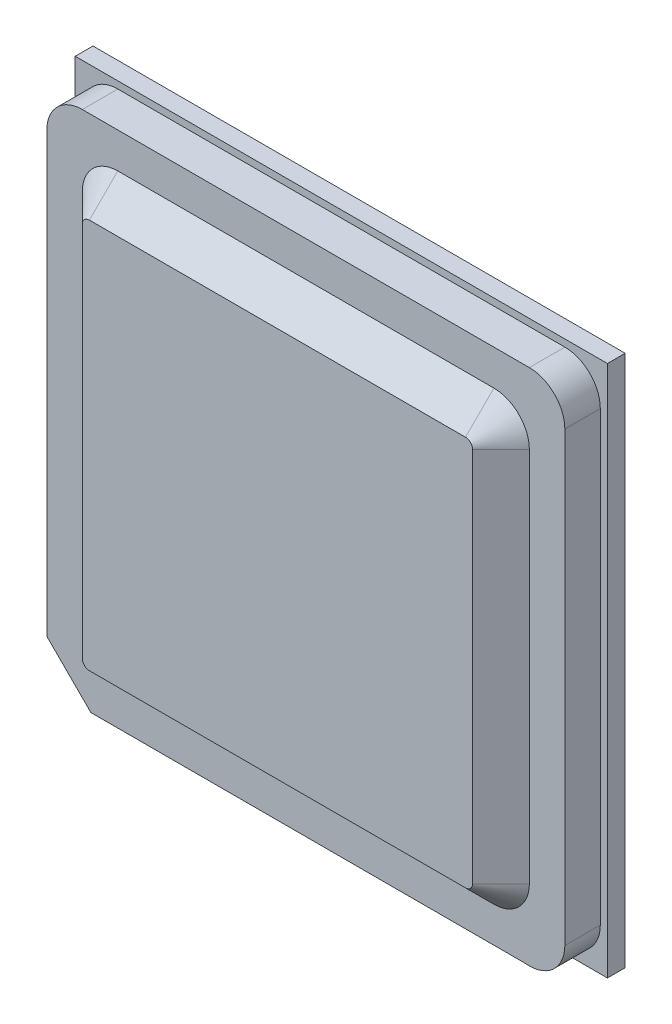
ISO-10303-21;
HEADER;
FILE_DESCRIPTION(('STEP AP214'),'2;1');
FILE_NAME('part.step','',(''),(''),'','','');
FILE_SCHEMA(('AUTOMOTIVE_DESIGN { 1 0 10303 214 1 1 1 1 }'));
ENDSEC;
DATA;
#1=APPLICATION_CONTEXT('core data for automotive mechanical design processes');
#2=APPLICATION_PROTOCOL_DEFINITION('international standard','automotive_design',2000,#1);
#3=PRODUCT_CONTEXT('',#1,'mechanical');
#4=PRODUCT('Part','Part','',(#3));
#5=PRODUCT_RELATED_PRODUCT_CATEGORY('part','',(#4));
#6=PRODUCT_DEFINITION_FORMATION('','',#4);
#7=PRODUCT_DEFINITION_CONTEXT('part definition',#1,'design');
#8=PRODUCT_DEFINITION('design','',#6,#7);
#9=PRODUCT_DEFINITION_SHAPE('','',#8);
#10=(LENGTH_UNIT() NAMED_UNIT(*) SI_UNIT(.MILLI.,.METRE.));
#11=(NAMED_UNIT(*) PLANE_ANGLE_UNIT() SI_UNIT($,.RADIAN.));
#12=(NAMED_UNIT(*) SI_UNIT($,.STERADIAN.) SOLID_ANGLE_UNIT());
#13=UNCERTAINTY_MEASURE_WITH_UNIT(LENGTH_MEASURE(1.E-05),#10,'distance_accuracy_value','');
#14=(GEOMETRIC_REPRESENTATION_CONTEXT(3) GLOBAL_UNCERTAINTY_ASSIGNED_CONTEXT((#13)) GLOBAL_UNIT_ASSIGNED_CONTEXT((#10,
#11,#12)) REPRESENTATION_CONTEXT('',''));
#15=CARTESIAN_POINT('',(0.,0.,0.));
#16=DIRECTION('',(0.,0.,1.));
#17=DIRECTION('',(1.,0.,0.));
#18=AXIS2_PLACEMENT_3D('',#15,#16,#17);
#19=CARTESIAN_POINT('',(-5.3,-5.3,2.3));
#20=DIRECTION('',(0.,0.,1.));
#21=DIRECTION('',(1.,0.,0.));
#22=AXIS2_PLACEMENT_3D('',#19,#20,#21);
#23=PLANE('',#22);
#24=CARTESIAN_POINT('',(-5.3,5.3,2.30000000004793));
#25=DIRECTION('',(0.,0.,-1.));
#26=DIRECTION('',(-1.,0.,0.));
#27=AXIS2_PLACEMENT_3D('',#24,#25,#26);
#28=CIRCLE('',#27,0.199999999983628);
#29=CARTESIAN_POINT('',(-5.49999999997603,5.3,2.30000000002397));
#30=VERTEX_POINT('',#29);
#31=CARTESIAN_POINT('',(-5.3,5.49999999998501,2.30000000005016));
#32=VERTEX_POINT('',#31);
#33=EDGE_CURVE('E182',#30,#32,#28,.T.);
#34=ORIENTED_EDGE('',*,*,#33,.F.);
#35=DIRECTION('',(0.,1.,0.));
#36=VECTOR('',#35,1.);
#37=CARTESIAN_POINT('',(-5.5,-5.3,2.3));
#38=LINE('',#37,#36);
#39=CARTESIAN_POINT('',(-5.49999999999923,-5.3,2.29999999995068));
#40=VERTEX_POINT('',#39);
#41=EDGE_CURVE('E159',#40,#30,#38,.T.);
#42=ORIENTED_EDGE('',*,*,#41,.F.);
#43=CARTESIAN_POINT('',(-5.3,-5.3,2.29999999993424));
#44=DIRECTION('',(0.,0.,-1.));
#45=DIRECTION('',(-1.,0.,0.));
#46=AXIS2_PLACEMENT_3D('',#43,#44,#45);
#47=CIRCLE('',#46,0.199999999972807);
#48=CARTESIAN_POINT('',(-5.3,-5.49999999999923,2.29999999995068));
#49=VERTEX_POINT('',#48);
#50=EDGE_CURVE('E20',#40,#49,#47,.F.);
#51=ORIENTED_EDGE('',*,*,#50,.T.);
#52=DIRECTION('',(1.,0.,0.));
#53=VECTOR('',#52,1.);
#54=CARTESIAN_POINT('',(-5.3,-5.5,2.3));
#55=LINE('',#54,#53);
#56=CARTESIAN_POINT('',(5.3,-5.49999999999923,2.29999999995068));
#57=VERTEX_POINT('',#56);
#58=EDGE_CURVE('E157',#57,#49,#55,.F.);
#59=ORIENTED_EDGE('',*,*,#58,.F.);
#60=CARTESIAN_POINT('',(5.3,-5.3,2.29999999993424));
#61=DIRECTION('',(0.,0.,-1.));
#62=DIRECTION('',(-1.,0.,0.));
#63=AXIS2_PLACEMENT_3D('',#60,#61,#62);
#64=CIRCLE('',#63,0.199999999972805);
#65=CARTESIAN_POINT('',(5.50000000003288,-5.3,2.29999999996712));
#66=VERTEX_POINT('',#65);
#67=EDGE_CURVE('E168',#66,#57,#64,.T.);
#68=ORIENTED_EDGE('',*,*,#67,.F.);
#69=DIRECTION('',(0.,1.,0.));
#70=VECTOR('',#69,1.);
#71=CARTESIAN_POINT('',(5.5,-5.3,2.3));
#72=LINE('',#71,#70);
#73=CARTESIAN_POINT('',(5.49999999999923,5.3,2.29999999999332));
#74=VERTEX_POINT('',#73);
#75=EDGE_CURVE('E191',#74,#66,#72,.F.);
#76=ORIENTED_EDGE('',*,*,#75,.F.);
#77=CARTESIAN_POINT('',(5.3,5.3,2.29999999999109));
#78=DIRECTION('',(0.,0.,-1.));
#79=DIRECTION('',(0.,1.,0.));
#80=AXIS2_PLACEMENT_3D('',#77,#78,#79);
#81=CIRCLE('',#80,0.199999999983629);
#82=CARTESIAN_POINT('',(5.3,5.50000000000445,2.29999999999554));
#83=VERTEX_POINT('',#82);
#84=EDGE_CURVE('E188',#83,#74,#81,.T.);
#85=ORIENTED_EDGE('',*,*,#84,.F.);
#86=DIRECTION('',(1.,0.,0.));
#87=VECTOR('',#86,1.);
#88=CARTESIAN_POINT('',(-5.3,5.5,2.3));
#89=LINE('',#88,#87);
#90=EDGE_CURVE('E185',#32,#83,#89,.T.);
#91=ORIENTED_EDGE('',*,*,#90,.F.);
#92=EDGE_LOOP('',(#34,#42,#51,#59,#68,#76,#85,#91));
#93=FACE_BOUND('',#92,.T.);
#94=ADVANCED_FACE('F17',(#93),#23,.T.);
#95=CARTESIAN_POINT('',(-5.3,-6.3,1.5));
#96=DIRECTION('',(0.,-0.707106781186547,0.707106781186548));
#97=DIRECTION('',(0.,-0.707106781186548,-0.707106781186547));
#98=AXIS2_PLACEMENT_3D('',#95,#96,#97);
#99=PLANE('',#98);
#100=ORIENTED_EDGE('',*,*,#58,.T.);
#101=DIRECTION('',(0.,0.707106781186548,0.707106781186547));
#102=VECTOR('',#101,1.);
#103=CARTESIAN_POINT('',(-5.29999999996945,-499007.800000001,-499000.));
#104=LINE('',#103,#102);
#105=CARTESIAN_POINT('',(-5.3,-6.29999999998834,1.4999999999734));
#106=VERTEX_POINT('',#105);
#107=EDGE_CURVE('E165',#106,#49,#104,.T.);
#108=ORIENTED_EDGE('',*,*,#107,.F.);
#109=DIRECTION('',(-1.,0.,0.));
#110=VECTOR('',#109,1.);
#111=CARTESIAN_POINT('',(6.3,-6.3,1.5));
#112=LINE('',#111,#110);
#113=CARTESIAN_POINT('',(5.3,-6.29999999998834,1.4999999999734));
#114=VERTEX_POINT('',#113);
#115=EDGE_CURVE('E175',#106,#114,#112,.F.);
#116=ORIENTED_EDGE('',*,*,#115,.T.);
#117=DIRECTION('',(0.,0.707106781186548,0.707106781186547));
#118=VECTOR('',#117,1.);
#119=CARTESIAN_POINT('',(5.30000000009166,-499007.800000001,-499000.));
#120=LINE('',#119,#118);
#121=EDGE_CURVE('E167',#57,#114,#120,.F.);
#122=ORIENTED_EDGE('',*,*,#121,.F.);
#123=EDGE_LOOP('',(#100,#108,#116,#122));
#124=FACE_BOUND('',#123,.T.);
#125=ADVANCED_FACE('F163',(#124),#99,.T.);
#126=CARTESIAN_POINT('',(5.3,-5.3,1.49999999996453));
#127=DIRECTION('',(0.,0.,-1.));
#128=DIRECTION('',(-1.,0.,0.));
#129=AXIS2_PLACEMENT_3D('',#126,#127,#128);
#130=CONICAL_SURFACE('',#129,0.999999999942519,0.785398163397448);
#131=ORIENTED_EDGE('',*,*,#67,.T.);
#132=ORIENTED_EDGE('',*,*,#121,.T.);
#133=CARTESIAN_POINT('',(5.3,-5.3,1.49999999996453));
#134=DIRECTION('',(0.,0.,-1.));
#135=DIRECTION('',(-1.,0.,0.));
#136=AXIS2_PLACEMENT_3D('',#133,#134,#135);
#137=CIRCLE('',#136,0.999999999942519);
#138=CARTESIAN_POINT('',(6.30000000001773,-5.3,1.49999999998226));
#139=VERTEX_POINT('',#138);
#140=EDGE_CURVE('E231',#114,#139,#137,.F.);
#141=ORIENTED_EDGE('',*,*,#140,.T.);
#142=DIRECTION('',(0.707106781186548,0.,-0.707106781186547));
#143=VECTOR('',#142,1.);
#144=CARTESIAN_POINT('',(6.3,-5.3,1.5));
#145=LINE('',#144,#143);
#146=EDGE_CURVE('E189',#66,#139,#145,.T.);
#147=ORIENTED_EDGE('',*,*,#146,.F.);
#148=EDGE_LOOP('',(#131,#132,#141,#147));
#149=FACE_BOUND('',#148,.T.);
#150=ADVANCED_FACE('F241',(#149),#130,.T.);
#151=CARTESIAN_POINT('',(6.3,-5.3,1.5));
#152=DIRECTION('',(0.707106781186547,0.,0.707106781186548));
#153=DIRECTION('',(0.707106781186548,0.,-0.707106781186547));
#154=AXIS2_PLACEMENT_3D('',#151,#152,#153);
#155=PLANE('',#154);
#156=ORIENTED_EDGE('',*,*,#75,.T.);
#157=ORIENTED_EDGE('',*,*,#146,.T.);
#158=DIRECTION('',(0.,1.,0.));
#159=VECTOR('',#158,1.);
#160=CARTESIAN_POINT('',(6.3,-6.30624362077431,1.5));
#161=LINE('',#160,#159);
#162=CARTESIAN_POINT('',(6.29999999998834,5.3,1.50000000001603));
#163=VERTEX_POINT('',#162);
#164=EDGE_CURVE('E230',#139,#163,#161,.T.);
#165=ORIENTED_EDGE('',*,*,#164,.T.);
#166=DIRECTION('',(-0.707106781186548,0.,0.707106781186547));
#167=VECTOR('',#166,1.);
#168=CARTESIAN_POINT('',(499000.,5.3,-498992.199999999));
#169=LINE('',#168,#167);
#170=EDGE_CURVE('E186',#74,#163,#169,.F.);
#171=ORIENTED_EDGE('',*,*,#170,.F.);
#172=EDGE_LOOP('',(#156,#157,#165,#171));
#173=FACE_BOUND('',#172,.T.);
#174=ADVANCED_FACE('F250',(#173),#155,.T.);
#175=CARTESIAN_POINT('',(5.3,5.3,1.50000000002137));
#176=DIRECTION('',(0.,0.,-1.));
#177=DIRECTION('',(0.,1.,0.));
#178=AXIS2_PLACEMENT_3D('',#175,#176,#177);
#179=CONICAL_SURFACE('',#178,0.999999999953343,0.785398163397448);
#180=ORIENTED_EDGE('',*,*,#84,.T.);
#181=ORIENTED_EDGE('',*,*,#170,.T.);
#182=CARTESIAN_POINT('',(5.3,5.3,1.50000000002137));
#183=DIRECTION('',(0.,0.,-1.));
#184=DIRECTION('',(0.,1.,0.));
#185=AXIS2_PLACEMENT_3D('',#182,#183,#184);
#186=CIRCLE('',#185,0.999999999953343);
#187=CARTESIAN_POINT('',(5.3,6.29999999998931,1.50000000001069));
#188=VERTEX_POINT('',#187);
#189=EDGE_CURVE('E227',#163,#188,#186,.F.);
#190=ORIENTED_EDGE('',*,*,#189,.T.);
#191=DIRECTION('',(0.,-0.707106781186548,0.707106781186547));
#192=VECTOR('',#191,1.);
#193=CARTESIAN_POINT('',(5.3,6.3,1.5));
#194=LINE('',#193,#192);
#195=EDGE_CURVE('E183',#83,#188,#194,.F.);
#196=ORIENTED_EDGE('',*,*,#195,.F.);
#197=EDGE_LOOP('',(#180,#181,#190,#196));
#198=FACE_BOUND('',#197,.T.);
#199=ADVANCED_FACE('F254',(#198),#179,.T.);
#200=CARTESIAN_POINT('',(-5.3,6.3,1.5));
#201=DIRECTION('',(0.,0.707106781186547,0.707106781186548));
#202=DIRECTION('',(0.,-0.707106781186548,0.707106781186547));
#203=AXIS2_PLACEMENT_3D('',#200,#201,#202);
#204=PLANE('',#203);
#205=ORIENTED_EDGE('',*,*,#90,.T.);
#206=ORIENTED_EDGE('',*,*,#195,.T.);
#207=DIRECTION('',(-1.,0.,0.));
#208=VECTOR('',#207,1.);
#209=CARTESIAN_POINT('',(6.3,6.3,1.5));
#210=LINE('',#209,#208);
#211=CARTESIAN_POINT('',(-5.3,6.29999999998834,1.50000000001603));
#212=VERTEX_POINT('',#211);
#213=EDGE_CURVE('E226',#188,#212,#210,.T.);
#214=ORIENTED_EDGE('',*,*,#213,.T.);
#215=DIRECTION('',(0.,-0.707106781186548,0.707106781186547));
#216=VECTOR('',#215,1.);
#217=CARTESIAN_POINT('',(-5.30000000003056,499000.,-498992.199999999));
#218=LINE('',#217,#216);
#219=EDGE_CURVE('E180',#32,#212,#218,.F.);
#220=ORIENTED_EDGE('',*,*,#219,.F.);
#221=EDGE_LOOP('',(#205,#206,#214,#220));
#222=FACE_BOUND('',#221,.T.);
#223=ADVANCED_FACE('F445',(#222),#204,.T.);
#224=CARTESIAN_POINT('',(-5.3,5.3,1.50000000013506));
#225=DIRECTION('',(0.,0.,-1.));
#226=DIRECTION('',(-1.,0.,0.));
#227=AXIS2_PLACEMENT_3D('',#224,#225,#226);
#228=CONICAL_SURFACE('',#227,0.999999999896499,0.785398163397448);
#229=ORIENTED_EDGE('',*,*,#33,.T.);
#230=ORIENTED_EDGE('',*,*,#219,.T.);
#231=CARTESIAN_POINT('',(-5.3,5.3,1.50000000002137));
#232=DIRECTION('',(0.,0.,-1.));
#233=DIRECTION('',(-1.,0.,0.));
#234=AXIS2_PLACEMENT_3D('',#231,#232,#233);
#235=CIRCLE('',#234,1.00000000001019);
#236=CARTESIAN_POINT('',(-6.29999999998931,5.3,1.50000000001069));
#237=VERTEX_POINT('',#236);
#238=EDGE_CURVE('E223',#212,#237,#235,.F.);
#239=ORIENTED_EDGE('',*,*,#238,.T.);
#240=DIRECTION('',(0.707106781186548,0.,0.707106781186547));
#241=VECTOR('',#240,1.);
#242=CARTESIAN_POINT('',(-6.3,5.3,1.5));
#243=LINE('',#242,#241);
#244=EDGE_CURVE('E173',#30,#237,#243,.F.);
#245=ORIENTED_EDGE('',*,*,#244,.F.);
#246=EDGE_LOOP('',(#229,#230,#239,#245));
#247=FACE_BOUND('',#246,.T.);
#248=ADVANCED_FACE('F441',(#247),#228,.T.);
#249=CARTESIAN_POINT('',(-6.3,-5.3,1.5));
#250=DIRECTION('',(-0.707106781186547,0.,0.707106781186548));
#251=DIRECTION('',(0.707106781186548,0.,0.707106781186547));
#252=AXIS2_PLACEMENT_3D('',#249,#250,#251);
#253=PLANE('',#252);
#254=ORIENTED_EDGE('',*,*,#41,.T.);
#255=ORIENTED_EDGE('',*,*,#244,.T.);
#256=DIRECTION('',(0.,1.,0.));
#257=VECTOR('',#256,1.);
#258=CARTESIAN_POINT('',(-6.3,-6.30624362077431,1.5));
#259=LINE('',#258,#257);
#260=CARTESIAN_POINT('',(-6.29999999998834,-5.3,1.4999999999734));
#261=VERTEX_POINT('',#260);
#262=EDGE_CURVE('E222',#237,#261,#259,.F.);
#263=ORIENTED_EDGE('',*,*,#262,.T.);
#264=DIRECTION('',(0.707106781186548,0.,0.707106781186547));
#265=VECTOR('',#264,1.);
#266=CARTESIAN_POINT('',(-499007.800000001,-5.30000000006111,-499000.));
#267=LINE('',#266,#265);
#268=EDGE_CURVE('E172',#40,#261,#267,.F.);
#269=ORIENTED_EDGE('',*,*,#268,.F.);
#270=EDGE_LOOP('',(#254,#255,#263,#269));
#271=FACE_BOUND('',#270,.T.);
#272=ADVANCED_FACE('F438',(#271),#253,.T.);
#273=CARTESIAN_POINT('',(-5.3,-5.3,1.49999999996453));
#274=DIRECTION('',(0.,0.,-1.));
#275=DIRECTION('',(-1.,0.,0.));
#276=AXIS2_PLACEMENT_3D('',#273,#274,#275);
#277=CONICAL_SURFACE('',#276,0.999999999942521,0.785398163397448);
#278=ORIENTED_EDGE('',*,*,#50,.F.);
#279=ORIENTED_EDGE('',*,*,#268,.T.);
#280=CARTESIAN_POINT('',(-5.3,-5.3,1.49999999996453));
#281=DIRECTION('',(0.,0.,-1.));
#282=DIRECTION('',(-1.,0.,0.));
#283=AXIS2_PLACEMENT_3D('',#280,#281,#282);
#284=CIRCLE('',#283,0.999999999942521);
#285=EDGE_CURVE('E171',#261,#106,#284,.F.);
#286=ORIENTED_EDGE('',*,*,#285,.T.);
#287=ORIENTED_EDGE('',*,*,#107,.T.);
#288=EDGE_LOOP('',(#278,#279,#286,#287));
#289=FACE_BOUND('',#288,.T.);
#290=ADVANCED_FACE('F169',(#289),#277,.T.);
#291=CARTESIAN_POINT('',(-7.01350631817886,-7.01350631817886,0.4));
#292=DIRECTION('',(0.,0.,1.));
#293=DIRECTION('',(1.,0.,0.));
#294=AXIS2_PLACEMENT_3D('',#291,#292,#293);
#295=PLANE('',#294);
#296=CARTESIAN_POINT('',(-7.01350631817886,-7.01350631817886,0.4));
#297=DIRECTION('',(0.,0.,1.));
#298=DIRECTION('',(1.,0.,0.));
#299=AXIS2_PLACEMENT_3D('',#296,#297,#298);
#300=CIRCLE('',#299,0.2);
#301=CARTESIAN_POINT('',(-6.81350631817886,-7.01350631817886,0.4));
#302=VERTEX_POINT('',#301);
#303=EDGE_CURVE('E218',#302,#302,#300,.T.);
#304=ORIENTED_EDGE('',*,*,#303,.T.);
#305=EDGE_LOOP('',(#304));
#306=FACE_BOUND('',#305,.T.);
#307=ADVANCED_FACE('F432',(#306),#295,.T.);
#308=CARTESIAN_POINT('',(6.3,-6.30624362077431,1.5));
#309=DIRECTION('',(0.,0.,-1.));
#310=DIRECTION('',(-1.,0.,0.));
#311=AXIS2_PLACEMENT_3D('',#308,#309,#310);
#312=PLANE('',#311);
#313=ORIENTED_EDGE('',*,*,#262,.F.);
#314=ORIENTED_EDGE('',*,*,#238,.F.);
#315=ORIENTED_EDGE('',*,*,#213,.F.);
#316=ORIENTED_EDGE('',*,*,#189,.F.);
#317=ORIENTED_EDGE('',*,*,#164,.F.);
#318=ORIENTED_EDGE('',*,*,#140,.F.);
#319=ORIENTED_EDGE('',*,*,#115,.F.);
#320=ORIENTED_EDGE('',*,*,#285,.F.);
#321=EDGE_LOOP('',(#313,#314,#315,#316,#317,#318,#319,#320));
#322=FACE_BOUND('',#321,.T.);
#323=DIRECTION('',(0.,1.,0.));
#324=VECTOR('',#323,1.);
#325=CARTESIAN_POINT('',(7.3,-6.30624362077431,1.5));
#326=LINE('',#325,#324);
#327=CARTESIAN_POINT('',(7.3,-6.30624362077431,1.5));
#328=VERTEX_POINT('',#327);
#329=CARTESIAN_POINT('',(7.3,6.3,1.5));
#330=VERTEX_POINT('',#329);
#331=EDGE_CURVE('E297',#328,#330,#326,.T.);
#332=ORIENTED_EDGE('',*,*,#331,.T.);
#333=CARTESIAN_POINT('',(6.3,6.3,1.5));
#334=DIRECTION('',(0.,0.,-1.));
#335=DIRECTION('',(-1.,0.,0.));
#336=AXIS2_PLACEMENT_3D('',#333,#334,#335);
#337=CIRCLE('',#336,1.);
#338=CARTESIAN_POINT('',(6.3,7.3,1.5));
#339=VERTEX_POINT('',#338);
#340=EDGE_CURVE('E207',#339,#330,#337,.T.);
#341=ORIENTED_EDGE('',*,*,#340,.F.);
#342=DIRECTION('',(1.,0.,0.));
#343=VECTOR('',#342,1.);
#344=CARTESIAN_POINT('',(6.3,7.3,1.5));
#345=LINE('',#344,#343);
#346=CARTESIAN_POINT('',(-6.3,7.3,1.5));
#347=VERTEX_POINT('',#346);
#348=EDGE_CURVE('E213',#339,#347,#345,.F.);
#349=ORIENTED_EDGE('',*,*,#348,.T.);
#350=CARTESIAN_POINT('',(-6.3,6.3,1.5));
#351=DIRECTION('',(0.,0.,-1.));
#352=DIRECTION('',(-1.,0.,0.));
#353=AXIS2_PLACEMENT_3D('',#350,#351,#352);
#354=CIRCLE('',#353,1.);
#355=CARTESIAN_POINT('',(-7.3,6.3,1.5));
#356=VERTEX_POINT('',#355);
#357=EDGE_CURVE('E211',#356,#347,#354,.T.);
#358=ORIENTED_EDGE('',*,*,#357,.F.);
#359=DIRECTION('',(0.,1.,0.));
#360=VECTOR('',#359,1.);
#361=CARTESIAN_POINT('',(-7.3,-6.06,1.5));
#362=LINE('',#361,#360);
#363=CARTESIAN_POINT('',(-7.3,-6.06,1.5));
#364=VERTEX_POINT('',#363);
#365=EDGE_CURVE('E273',#356,#364,#362,.F.);
#366=ORIENTED_EDGE('',*,*,#365,.T.);
#367=DIRECTION('',(-0.707106781186547,0.707106781186548,0.));
#368=VECTOR('',#367,1.);
#369=CARTESIAN_POINT('',(-7.3,-6.06,1.5));
#370=LINE('',#369,#368);
#371=CARTESIAN_POINT('',(-6.06,-7.3,1.5));
#372=VERTEX_POINT('',#371);
#373=EDGE_CURVE('E280',#364,#372,#370,.F.);
#374=ORIENTED_EDGE('',*,*,#373,.T.);
#375=DIRECTION('',(-1.,0.,0.));
#376=VECTOR('',#375,1.);
#377=CARTESIAN_POINT('',(-6.06,-7.3,1.5));
#378=LINE('',#377,#376);
#379=CARTESIAN_POINT('',(6.18842823498641,-7.3,1.5));
#380=VERTEX_POINT('',#379);
#381=EDGE_CURVE('E217',#372,#380,#378,.F.);
#382=ORIENTED_EDGE('',*,*,#381,.T.);
#383=CARTESIAN_POINT('',(6.3,-6.30624362077431,1.5));
#384=DIRECTION('',(0.,0.,-1.));
#385=DIRECTION('',(-1.,0.,0.));
#386=AXIS2_PLACEMENT_3D('',#383,#384,#385);
#387=CIRCLE('',#386,1.);
#388=EDGE_CURVE('E215',#328,#380,#387,.T.);
#389=ORIENTED_EDGE('',*,*,#388,.F.);
#390=EDGE_LOOP('',(#332,#341,#349,#358,#366,#374,#382,#389));
#391=FACE_BOUND('',#390,.T.);
#392=ADVANCED_FACE('F258',(#322,#391),#312,.F.);
#393=CARTESIAN_POINT('',(-7.01350631817886,-7.01350631817886,0.4));
#394=DIRECTION('',(0.,0.,1.));
#395=DIRECTION('',(1.,0.,0.));
#396=AXIS2_PLACEMENT_3D('',#393,#394,#395);
#397=CYLINDRICAL_SURFACE('',#396,0.2);
#398=CARTESIAN_POINT('',(-7.01350631817886,-7.01350631817886,0.5));
#399=DIRECTION('',(0.,0.,1.));
#400=DIRECTION('',(1.,0.,0.));
#401=AXIS2_PLACEMENT_3D('',#398,#399,#400);
#402=CIRCLE('',#401,0.2);
#403=CARTESIAN_POINT('',(-6.81350631817886,-7.01350631817886,0.5));
#404=VERTEX_POINT('',#403);
#405=EDGE_CURVE('E203',#404,#404,#402,.F.);
#406=ORIENTED_EDGE('',*,*,#405,.F.);
#407=EDGE_LOOP('',(#406));
#408=FACE_BOUND('',#407,.T.);
#409=ORIENTED_EDGE('',*,*,#303,.F.);
#410=EDGE_LOOP('',(#409));
#411=FACE_BOUND('',#410,.T.);
#412=ADVANCED_FACE('F426',(#408,#411),#397,.F.);
#413=CARTESIAN_POINT('',(6.3,-6.30624362077431,1.5));
#414=DIRECTION('',(0.,0.,-1.));
#415=DIRECTION('',(-1.,0.,0.));
#416=AXIS2_PLACEMENT_3D('',#413,#414,#415);
#417=CYLINDRICAL_SURFACE('',#416,1.);
#418=ORIENTED_EDGE('',*,*,#388,.T.);
#419=DIRECTION('',(0.,0.,1.));
#420=VECTOR('',#419,1.);
#421=CARTESIAN_POINT('',(6.18842823498642,-7.3,1.5));
#422=LINE('',#421,#420);
#423=CARTESIAN_POINT('',(6.18842823498641,-7.3,0.5));
#424=VERTEX_POINT('',#423);
#425=EDGE_CURVE('E283',#380,#424,#422,.F.);
#426=ORIENTED_EDGE('',*,*,#425,.T.);
#427=CARTESIAN_POINT('',(6.3,-6.30624362077431,0.5));
#428=DIRECTION('',(0.,0.,-1.));
#429=DIRECTION('',(-1.,0.,0.));
#430=AXIS2_PLACEMENT_3D('',#427,#428,#429);
#431=CIRCLE('',#430,1.);
#432=CARTESIAN_POINT('',(7.3,-6.30624362077431,0.5));
#433=VERTEX_POINT('',#432);
#434=EDGE_CURVE('E200',#433,#424,#431,.T.);
#435=ORIENTED_EDGE('',*,*,#434,.F.);
#436=DIRECTION('',(0.,0.,1.));
#437=VECTOR('',#436,1.);
#438=CARTESIAN_POINT('',(7.3,-6.30624362077431,1.5));
#439=LINE('',#438,#437);
#440=EDGE_CURVE('E209',#433,#328,#439,.T.);
#441=ORIENTED_EDGE('',*,*,#440,.T.);
#442=EDGE_LOOP('',(#418,#426,#435,#441));
#443=FACE_BOUND('',#442,.T.);
#444=ADVANCED_FACE('F423',(#443),#417,.T.);
#445=CARTESIAN_POINT('',(-6.06,-7.3,1.5));
#446=DIRECTION('',(0.,1.,0.));
#447=DIRECTION('',(-1.,0.,0.));
#448=AXIS2_PLACEMENT_3D('',#445,#446,#447);
#449=PLANE('',#448);
#450=ORIENTED_EDGE('',*,*,#425,.F.);
#451=ORIENTED_EDGE('',*,*,#381,.F.);
#452=DIRECTION('',(0.,0.,1.));
#453=VECTOR('',#452,1.);
#454=CARTESIAN_POINT('',(-6.06,-7.3,1.5));
#455=LINE('',#454,#453);
#456=CARTESIAN_POINT('',(-6.06,-7.3,0.5));
#457=VERTEX_POINT('',#456);
#458=EDGE_CURVE('E277',#372,#457,#455,.F.);
#459=ORIENTED_EDGE('',*,*,#458,.T.);
#460=DIRECTION('',(1.,0.,0.));
#461=VECTOR('',#460,1.);
#462=CARTESIAN_POINT('',(0.,-7.3,0.5));
#463=LINE('',#462,#461);
#464=EDGE_CURVE('E202',#424,#457,#463,.F.);
#465=ORIENTED_EDGE('',*,*,#464,.F.);
#466=EDGE_LOOP('',(#450,#451,#459,#465));
#467=FACE_BOUND('',#466,.T.);
#468=ADVANCED_FACE('F324',(#467),#449,.F.);
#469=CARTESIAN_POINT('',(-7.3,-6.06,1.5));
#470=DIRECTION('',(0.707106781186548,0.707106781186547,0.));
#471=DIRECTION('',(-0.707106781186547,0.707106781186548,0.));
#472=AXIS2_PLACEMENT_3D('',#469,#470,#471);
#473=PLANE('',#472);
#474=ORIENTED_EDGE('',*,*,#458,.F.);
#475=ORIENTED_EDGE('',*,*,#373,.F.);
#476=DIRECTION('',(0.,0.,1.));
#477=VECTOR('',#476,1.);
#478=CARTESIAN_POINT('',(-7.3,-6.06,1.5));
#479=LINE('',#478,#477);
#480=CARTESIAN_POINT('',(-7.3,-6.06,0.5));
#481=VERTEX_POINT('',#480);
#482=EDGE_CURVE('E276',#364,#481,#479,.F.);
#483=ORIENTED_EDGE('',*,*,#482,.T.);
#484=DIRECTION('',(-0.707106781186547,0.707106781186548,0.));
#485=VECTOR('',#484,1.);
#486=CARTESIAN_POINT('',(-6.06,-7.3,0.5));
#487=LINE('',#486,#485);
#488=EDGE_CURVE('E317',#457,#481,#487,.T.);
#489=ORIENTED_EDGE('',*,*,#488,.F.);
#490=EDGE_LOOP('',(#474,#475,#483,#489));
#491=FACE_BOUND('',#490,.T.);
#492=ADVANCED_FACE('F326',(#491),#473,.F.);
#493=CARTESIAN_POINT('',(-7.3,-6.06,1.5));
#494=DIRECTION('',(1.,0.,0.));
#495=DIRECTION('',(0.,1.,0.));
#496=AXIS2_PLACEMENT_3D('',#493,#494,#495);
#497=PLANE('',#496);
#498=ORIENTED_EDGE('',*,*,#482,.F.);
#499=ORIENTED_EDGE('',*,*,#365,.F.);
#500=DIRECTION('',(0.,0.,-1.));
#501=VECTOR('',#500,1.);
#502=CARTESIAN_POINT('',(-7.3,6.3,1.5));
#503=LINE('',#502,#501);
#504=CARTESIAN_POINT('',(-7.3,6.3,0.5));
#505=VERTEX_POINT('',#504);
#506=EDGE_CURVE('E214',#505,#356,#503,.F.);
#507=ORIENTED_EDGE('',*,*,#506,.F.);
#508=DIRECTION('',(0.,1.,0.));
#509=VECTOR('',#508,1.);
#510=CARTESIAN_POINT('',(-7.3,0.,0.5));
#511=LINE('',#510,#509);
#512=EDGE_CURVE('E199',#481,#505,#511,.T.);
#513=ORIENTED_EDGE('',*,*,#512,.F.);
#514=EDGE_LOOP('',(#498,#499,#507,#513));
#515=FACE_BOUND('',#514,.T.);
#516=ADVANCED_FACE('F414',(#515),#497,.F.);
#517=CARTESIAN_POINT('',(-6.3,6.3,1.5));
#518=DIRECTION('',(0.,0.,-1.));
#519=DIRECTION('',(-1.,0.,0.));
#520=AXIS2_PLACEMENT_3D('',#517,#518,#519);
#521=CYLINDRICAL_SURFACE('',#520,1.);
#522=ORIENTED_EDGE('',*,*,#357,.T.);
#523=DIRECTION('',(0.,0.,-1.));
#524=VECTOR('',#523,1.);
#525=CARTESIAN_POINT('',(-6.3,7.3,1.5));
#526=LINE('',#525,#524);
#527=CARTESIAN_POINT('',(-6.3,7.3,0.5));
#528=VERTEX_POINT('',#527);
#529=EDGE_CURVE('E272',#347,#528,#526,.T.);
#530=ORIENTED_EDGE('',*,*,#529,.T.);
#531=CARTESIAN_POINT('',(-6.3,6.3,0.5));
#532=DIRECTION('',(0.,0.,-1.));
#533=DIRECTION('',(-1.,0.,0.));
#534=AXIS2_PLACEMENT_3D('',#531,#532,#533);
#535=CIRCLE('',#534,1.);
#536=EDGE_CURVE('E197',#505,#528,#535,.T.);
#537=ORIENTED_EDGE('',*,*,#536,.F.);
#538=ORIENTED_EDGE('',*,*,#506,.T.);
#539=EDGE_LOOP('',(#522,#530,#537,#538));
#540=FACE_BOUND('',#539,.T.);
#541=ADVANCED_FACE('F410',(#540),#521,.T.);
#542=CARTESIAN_POINT('',(6.3,7.3,1.5));
#543=DIRECTION('',(0.,-1.,0.));
#544=DIRECTION('',(0.,0.,-1.));
#545=AXIS2_PLACEMENT_3D('',#542,#543,#544);
#546=PLANE('',#545);
#547=ORIENTED_EDGE('',*,*,#529,.F.);
#548=ORIENTED_EDGE('',*,*,#348,.F.);
#549=DIRECTION('',(0.,0.,-1.));
#550=VECTOR('',#549,1.);
#551=CARTESIAN_POINT('',(6.3,7.3,1.5));
#552=LINE('',#551,#550);
#553=CARTESIAN_POINT('',(6.3,7.3,0.5));
#554=VERTEX_POINT('',#553);
#555=EDGE_CURVE('E210',#554,#339,#552,.F.);
#556=ORIENTED_EDGE('',*,*,#555,.F.);
#557=DIRECTION('',(1.,0.,0.));
#558=VECTOR('',#557,1.);
#559=CARTESIAN_POINT('',(0.,7.3,0.5));
#560=LINE('',#559,#558);
#561=EDGE_CURVE('E196',#528,#554,#560,.T.);
#562=ORIENTED_EDGE('',*,*,#561,.F.);
#563=EDGE_LOOP('',(#547,#548,#556,#562));
#564=FACE_BOUND('',#563,.T.);
#565=ADVANCED_FACE('F406',(#564),#546,.F.);
#566=CARTESIAN_POINT('',(6.3,6.3,1.5));
#567=DIRECTION('',(0.,0.,-1.));
#568=DIRECTION('',(-1.,0.,0.));
#569=AXIS2_PLACEMENT_3D('',#566,#567,#568);
#570=CYLINDRICAL_SURFACE('',#569,1.);
#571=ORIENTED_EDGE('',*,*,#340,.T.);
#572=DIRECTION('',(0.,0.,1.));
#573=VECTOR('',#572,1.);
#574=CARTESIAN_POINT('',(7.3,6.3,1.5));
#575=LINE('',#574,#573);
#576=CARTESIAN_POINT('',(7.3,6.3,0.5));
#577=VERTEX_POINT('',#576);
#578=EDGE_CURVE('E206',#330,#577,#575,.F.);
#579=ORIENTED_EDGE('',*,*,#578,.T.);
#580=CARTESIAN_POINT('',(6.3,6.3,0.5));
#581=DIRECTION('',(0.,0.,-1.));
#582=DIRECTION('',(-1.,0.,0.));
#583=AXIS2_PLACEMENT_3D('',#580,#581,#582);
#584=CIRCLE('',#583,1.);
#585=EDGE_CURVE('E193',#554,#577,#584,.T.);
#586=ORIENTED_EDGE('',*,*,#585,.F.);
#587=ORIENTED_EDGE('',*,*,#555,.T.);
#588=EDGE_LOOP('',(#571,#579,#586,#587));
#589=FACE_BOUND('',#588,.T.);
#590=ADVANCED_FACE('F402',(#589),#570,.T.);
#591=CARTESIAN_POINT('',(7.3,-6.30624362077431,1.5));
#592=DIRECTION('',(-1.,0.,0.));
#593=DIRECTION('',(0.,0.,1.));
#594=AXIS2_PLACEMENT_3D('',#591,#592,#593);
#595=PLANE('',#594);
#596=ORIENTED_EDGE('',*,*,#578,.F.);
#597=ORIENTED_EDGE('',*,*,#331,.F.);
#598=ORIENTED_EDGE('',*,*,#440,.F.);
#599=DIRECTION('',(0.,1.,0.));
#600=VECTOR('',#599,1.);
#601=CARTESIAN_POINT('',(7.3,0.,0.5));
#602=LINE('',#601,#600);
#603=EDGE_CURVE('E195',#577,#433,#602,.F.);
#604=ORIENTED_EDGE('',*,*,#603,.F.);
#605=EDGE_LOOP('',(#596,#597,#598,#604));
#606=FACE_BOUND('',#605,.T.);
#607=ADVANCED_FACE('F398',(#606),#595,.F.);
#608=CARTESIAN_POINT('',(0.,0.,0.5));
#609=DIRECTION('',(0.,0.,1.));
#610=DIRECTION('',(1.,0.,0.));
#611=AXIS2_PLACEMENT_3D('',#608,#609,#610);
#612=PLANE('',#611);
#613=DIRECTION('',(-1.,0.,0.));
#614=VECTOR('',#613,1.);
#615=CARTESIAN_POINT('',(-7.5,-7.5,0.5));
#616=LINE('',#615,#614);
#617=CARTESIAN_POINT('',(-7.5,-7.5,0.5));
#618=VERTEX_POINT('',#617);
#619=CARTESIAN_POINT('',(7.5,-7.5,0.5));
#620=VERTEX_POINT('',#619);
#621=EDGE_CURVE('E347',#618,#620,#616,.F.);
#622=ORIENTED_EDGE('',*,*,#621,.T.);
#623=DIRECTION('',(0.,-1.,0.));
#624=VECTOR('',#623,1.);
#625=CARTESIAN_POINT('',(7.5,-7.5,0.5));
#626=LINE('',#625,#624);
#627=CARTESIAN_POINT('',(7.5,7.5,0.5));
#628=VERTEX_POINT('',#627);
#629=EDGE_CURVE('E352',#620,#628,#626,.F.);
#630=ORIENTED_EDGE('',*,*,#629,.T.);
#631=DIRECTION('',(1.,0.,0.));
#632=VECTOR('',#631,1.);
#633=CARTESIAN_POINT('',(7.5,7.5,0.5));
#634=LINE('',#633,#632);
#635=CARTESIAN_POINT('',(-7.5,7.5,0.5));
#636=VERTEX_POINT('',#635);
#637=EDGE_CURVE('E355',#628,#636,#634,.F.);
#638=ORIENTED_EDGE('',*,*,#637,.T.);
#639=DIRECTION('',(0.,1.,0.));
#640=VECTOR('',#639,1.);
#641=CARTESIAN_POINT('',(-7.5,7.5,0.5));
#642=LINE('',#641,#640);
#643=EDGE_CURVE('E342',#636,#618,#642,.F.);
#644=ORIENTED_EDGE('',*,*,#643,.T.);
#645=EDGE_LOOP('',(#622,#630,#638,#644));
#646=FACE_BOUND('',#645,.T.);
#647=ORIENTED_EDGE('',*,*,#585,.T.);
#648=ORIENTED_EDGE('',*,*,#603,.T.);
#649=ORIENTED_EDGE('',*,*,#434,.T.);
#650=ORIENTED_EDGE('',*,*,#464,.T.);
#651=ORIENTED_EDGE('',*,*,#488,.T.);
#652=ORIENTED_EDGE('',*,*,#512,.T.);
#653=ORIENTED_EDGE('',*,*,#536,.T.);
#654=ORIENTED_EDGE('',*,*,#561,.T.);
#655=EDGE_LOOP('',(#647,#648,#649,#650,#651,#652,#653,#654));
#656=FACE_BOUND('',#655,.T.);
#657=ORIENTED_EDGE('',*,*,#405,.T.);
#658=EDGE_LOOP('',(#657));
#659=FACE_BOUND('',#658,.T.);
#660=ADVANCED_FACE('F330',(#646,#656,#659),#612,.T.);
#661=CARTESIAN_POINT('',(-7.5,7.5,0.5));
#662=DIRECTION('',(1.,0.,0.));
#663=DIRECTION('',(0.,1.,0.));
#664=AXIS2_PLACEMENT_3D('',#661,#662,#663);
#665=PLANE('',#664);
#666=DIRECTION('',(0.,0.,1.));
#667=VECTOR('',#666,1.);
#668=CARTESIAN_POINT('',(-7.5,-7.5,0.5));
#669=LINE('',#668,#667);
#670=CARTESIAN_POINT('',(-7.5,-7.5,0.));
#671=VERTEX_POINT('',#670);
#672=EDGE_CURVE('E344',#671,#618,#669,.T.);
#673=ORIENTED_EDGE('',*,*,#672,.T.);
#674=ORIENTED_EDGE('',*,*,#643,.F.);
#675=DIRECTION('',(0.,0.,1.));
#676=VECTOR('',#675,1.);
#677=CARTESIAN_POINT('',(-7.5,7.5,0.5));
#678=LINE('',#677,#676);
#679=CARTESIAN_POINT('',(-7.5,7.5,0.));
#680=VERTEX_POINT('',#679);
#681=EDGE_CURVE('E358',#636,#680,#678,.F.);
#682=ORIENTED_EDGE('',*,*,#681,.T.);
#683=DIRECTION('',(0.,1.,0.));
#684=VECTOR('',#683,1.);
#685=CARTESIAN_POINT('',(-7.5,0.,0.));
#686=LINE('',#685,#684);
#687=EDGE_CURVE('E361',#680,#671,#686,.F.);
#688=ORIENTED_EDGE('',*,*,#687,.T.);
#689=EDGE_LOOP('',(#673,#674,#682,#688));
#690=FACE_BOUND('',#689,.T.);
#691=ADVANCED_FACE('F379',(#690),#665,.F.);
#692=CARTESIAN_POINT('',(-7.5,-7.5,0.5));
#693=DIRECTION('',(0.,1.,0.));
#694=DIRECTION('',(-1.,0.,0.));
#695=AXIS2_PLACEMENT_3D('',#692,#693,#694);
#696=PLANE('',#695);
#697=DIRECTION('',(0.,0.,1.));
#698=VECTOR('',#697,1.);
#699=CARTESIAN_POINT('',(7.5,-7.5,0.5));
#700=LINE('',#699,#698);
#701=CARTESIAN_POINT('',(7.5,-7.5,0.));
#702=VERTEX_POINT('',#701);
#703=EDGE_CURVE('E349',#702,#620,#700,.T.);
#704=ORIENTED_EDGE('',*,*,#703,.T.);
#705=ORIENTED_EDGE('',*,*,#621,.F.);
#706=ORIENTED_EDGE('',*,*,#672,.F.);
#707=DIRECTION('',(1.,0.,0.));
#708=VECTOR('',#707,1.);
#709=CARTESIAN_POINT('',(0.,-7.5,0.));
#710=LINE('',#709,#708);
#711=EDGE_CURVE('E364',#671,#702,#710,.T.);
#712=ORIENTED_EDGE('',*,*,#711,.T.);
#713=EDGE_LOOP('',(#704,#705,#706,#712));
#714=FACE_BOUND('',#713,.T.);
#715=ADVANCED_FACE('F376',(#714),#696,.F.);
#716=CARTESIAN_POINT('',(7.5,-7.5,0.5));
#717=DIRECTION('',(-1.,0.,0.));
#718=DIRECTION('',(0.,-1.,0.));
#719=AXIS2_PLACEMENT_3D('',#716,#717,#718);
#720=PLANE('',#719);
#721=DIRECTION('',(0.,0.,1.));
#722=VECTOR('',#721,1.);
#723=CARTESIAN_POINT('',(7.5,7.5,0.5));
#724=LINE('',#723,#722);
#725=CARTESIAN_POINT('',(7.5,7.5,0.));
#726=VERTEX_POINT('',#725);
#727=EDGE_CURVE('E34',#726,#628,#724,.T.);
#728=ORIENTED_EDGE('',*,*,#727,.T.);
#729=ORIENTED_EDGE('',*,*,#629,.F.);
#730=ORIENTED_EDGE('',*,*,#703,.F.);
#731=DIRECTION('',(0.,1.,0.));
#732=VECTOR('',#731,1.);
#733=CARTESIAN_POINT('',(7.5,0.,0.));
#734=LINE('',#733,#732);
#735=EDGE_CURVE('E26',#702,#726,#734,.T.);
#736=ORIENTED_EDGE('',*,*,#735,.T.);
#737=EDGE_LOOP('',(#728,#729,#730,#736));
#738=FACE_BOUND('',#737,.T.);
#739=ADVANCED_FACE('F370',(#738),#720,.F.);
#740=CARTESIAN_POINT('',(7.5,7.5,0.5));
#741=DIRECTION('',(0.,-1.,0.));
#742=DIRECTION('',(1.,0.,0.));
#743=AXIS2_PLACEMENT_3D('',#740,#741,#742);
#744=PLANE('',#743);
#745=ORIENTED_EDGE('',*,*,#681,.F.);
#746=ORIENTED_EDGE('',*,*,#637,.F.);
#747=ORIENTED_EDGE('',*,*,#727,.F.);
#748=DIRECTION('',(1.,0.,0.));
#749=VECTOR('',#748,1.);
#750=CARTESIAN_POINT('',(0.,7.5,0.));
#751=LINE('',#750,#749);
#752=EDGE_CURVE('E11',#726,#680,#751,.F.);
#753=ORIENTED_EDGE('',*,*,#752,.T.);
#754=EDGE_LOOP('',(#745,#746,#747,#753));
#755=FACE_BOUND('',#754,.T.);
#756=ADVANCED_FACE('F381',(#755),#744,.F.);
#757=CARTESIAN_POINT('',(0.,0.,0.));
#758=DIRECTION('',(0.,0.,1.));
#759=DIRECTION('',(1.,0.,0.));
#760=AXIS2_PLACEMENT_3D('',#757,#758,#759);
#761=PLANE('',#760);
#762=ORIENTED_EDGE('',*,*,#735,.F.);
#763=ORIENTED_EDGE('',*,*,#711,.F.);
#764=ORIENTED_EDGE('',*,*,#687,.F.);
#765=ORIENTED_EDGE('',*,*,#752,.F.);
#766=EDGE_LOOP('',(#762,#763,#764,#765));
#767=FACE_BOUND('',#766,.T.);
#768=ADVANCED_FACE('F374',(#767),#761,.F.);
#769=CLOSED_SHELL('',(#94,#125,#150,#174,#199,#223,#248,#272,#290,#307,#392,#412,#444,#468,#492,
#516,#541,#565,#590,#607,#660,#691,#715,#739,#756,#768));
#770=MANIFOLD_SOLID_BREP('B1',#769);
#771=ADVANCED_BREP_SHAPE_REPRESENTATION('',(#18,#770),#14);
#772=SHAPE_DEFINITION_REPRESENTATION(#9,#771);
ENDSEC;
END-ISO-10303-21;
